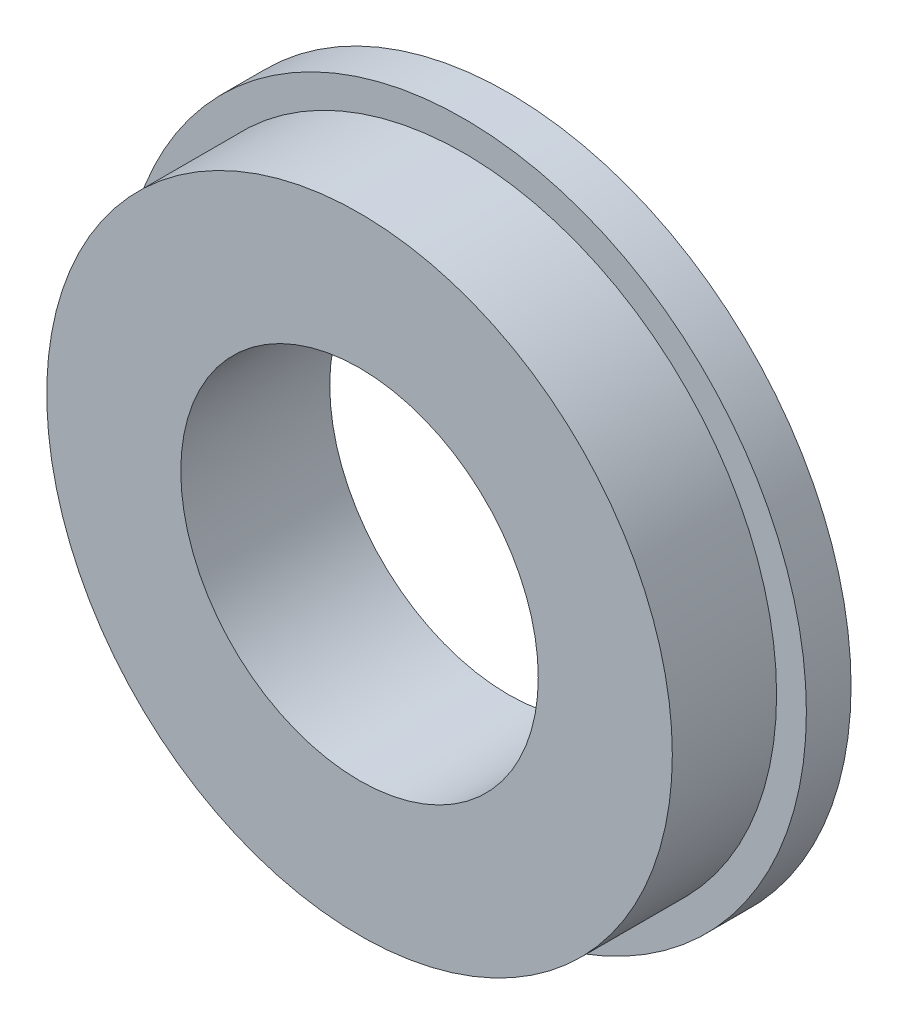
ISO-10303-21;
HEADER;
FILE_DESCRIPTION(('STEP AP214'),'2;1');
FILE_NAME('part.step','',(''),(''),'','','');
FILE_SCHEMA(('AUTOMOTIVE_DESIGN { 1 0 10303 214 1 1 1 1 }'));
ENDSEC;
DATA;
#1=APPLICATION_CONTEXT('core data for automotive mechanical design processes');
#2=APPLICATION_PROTOCOL_DEFINITION('international standard','automotive_design',2000,#1);
#3=PRODUCT_CONTEXT('',#1,'mechanical');
#4=PRODUCT('Part','Part','',(#3));
#5=PRODUCT_RELATED_PRODUCT_CATEGORY('part','',(#4));
#6=PRODUCT_DEFINITION_FORMATION('','',#4);
#7=PRODUCT_DEFINITION_CONTEXT('part definition',#1,'design');
#8=PRODUCT_DEFINITION('design','',#6,#7);
#9=PRODUCT_DEFINITION_SHAPE('','',#8);
#10=(LENGTH_UNIT() NAMED_UNIT(*) SI_UNIT(.MILLI.,.METRE.));
#11=(NAMED_UNIT(*) PLANE_ANGLE_UNIT() SI_UNIT($,.RADIAN.));
#12=(NAMED_UNIT(*) SI_UNIT($,.STERADIAN.) SOLID_ANGLE_UNIT());
#13=UNCERTAINTY_MEASURE_WITH_UNIT(LENGTH_MEASURE(1.E-05),#10,'distance_accuracy_value','');
#14=(GEOMETRIC_REPRESENTATION_CONTEXT(3) GLOBAL_UNCERTAINTY_ASSIGNED_CONTEXT((#13)) GLOBAL_UNIT_ASSIGNED_CONTEXT((#10,
#11,#12)) REPRESENTATION_CONTEXT('',''));
#15=CARTESIAN_POINT('',(0.,0.,0.));
#16=DIRECTION('',(0.,0.,1.));
#17=DIRECTION('',(1.,0.,0.));
#18=AXIS2_PLACEMENT_3D('',#15,#16,#17);
#19=CARTESIAN_POINT('',(0.,0.,1.5));
#20=DIRECTION('',(0.,0.,-1.));
#21=DIRECTION('',(-1.,0.,0.));
#22=AXIS2_PLACEMENT_3D('',#19,#20,#21);
#23=CYLINDRICAL_SURFACE('',#22,11.5);
#24=CARTESIAN_POINT('',(0.,0.,1.5));
#25=DIRECTION('',(0.,0.,1.));
#26=DIRECTION('',(1.,0.,0.));
#27=AXIS2_PLACEMENT_3D('',#24,#25,#26);
#28=CIRCLE('',#27,11.5);
#29=CARTESIAN_POINT('',(11.5,0.,1.5));
#30=VERTEX_POINT('',#29);
#31=EDGE_CURVE('E45',#30,#30,#28,.T.);
#32=ORIENTED_EDGE('',*,*,#31,.F.);
#33=EDGE_LOOP('',(#32));
#34=FACE_BOUND('',#33,.T.);
#35=CARTESIAN_POINT('',(0.,0.,0.));
#36=DIRECTION('',(0.,0.,1.));
#37=DIRECTION('',(1.,0.,0.));
#38=AXIS2_PLACEMENT_3D('',#35,#36,#37);
#39=CIRCLE('',#38,11.5);
#40=CARTESIAN_POINT('',(11.5,0.,0.));
#41=VERTEX_POINT('',#40);
#42=EDGE_CURVE('E40',#41,#41,#39,.T.);
#43=ORIENTED_EDGE('',*,*,#42,.T.);
#44=EDGE_LOOP('',(#43));
#45=FACE_BOUND('',#44,.T.);
#46=ADVANCED_FACE('F37',(#34,#45),#23,.T.);
#47=CARTESIAN_POINT('',(0.,0.,1.5));
#48=DIRECTION('',(0.,0.,1.));
#49=DIRECTION('',(1.,0.,0.));
#50=AXIS2_PLACEMENT_3D('',#47,#48,#49);
#51=PLANE('',#50);
#52=CARTESIAN_POINT('',(0.,0.,1.5));
#53=DIRECTION('',(0.,0.,1.));
#54=DIRECTION('',(1.,0.,0.));
#55=AXIS2_PLACEMENT_3D('',#52,#53,#54);
#56=CIRCLE('',#55,10.5);
#57=CARTESIAN_POINT('',(10.5,0.,1.5));
#58=VERTEX_POINT('',#57);
#59=EDGE_CURVE('E10',#58,#58,#56,.T.);
#60=ORIENTED_EDGE('',*,*,#59,.F.);
#61=EDGE_LOOP('',(#60));
#62=FACE_BOUND('',#61,.T.);
#63=ORIENTED_EDGE('',*,*,#31,.T.);
#64=EDGE_LOOP('',(#63));
#65=FACE_BOUND('',#64,.T.);
#66=ADVANCED_FACE('F86',(#62,#65),#51,.T.);
#67=CARTESIAN_POINT('',(0.,0.,0.));
#68=DIRECTION('',(0.,0.,1.));
#69=DIRECTION('',(1.,0.,0.));
#70=AXIS2_PLACEMENT_3D('',#67,#68,#69);
#71=PLANE('',#70);
#72=CARTESIAN_POINT('',(0.,0.,0.));
#73=DIRECTION('',(0.,0.,1.));
#74=DIRECTION('',(1.,0.,0.));
#75=AXIS2_PLACEMENT_3D('',#72,#73,#74);
#76=CIRCLE('',#75,6.);
#77=CARTESIAN_POINT('',(6.,0.,0.));
#78=VERTEX_POINT('',#77);
#79=EDGE_CURVE('E56',#78,#78,#76,.T.);
#80=ORIENTED_EDGE('',*,*,#79,.T.);
#81=EDGE_LOOP('',(#80));
#82=FACE_BOUND('',#81,.T.);
#83=ORIENTED_EDGE('',*,*,#42,.F.);
#84=EDGE_LOOP('',(#83));
#85=FACE_BOUND('',#84,.T.);
#86=ADVANCED_FACE('F65',(#82,#85),#71,.F.);
#87=CARTESIAN_POINT('',(0.,0.,5.));
#88=DIRECTION('',(0.,0.,-1.));
#89=DIRECTION('',(-1.,0.,0.));
#90=AXIS2_PLACEMENT_3D('',#87,#88,#89);
#91=CYLINDRICAL_SURFACE('',#90,10.5);
#92=CARTESIAN_POINT('',(0.,0.,5.));
#93=DIRECTION('',(0.,0.,1.));
#94=DIRECTION('',(1.,0.,0.));
#95=AXIS2_PLACEMENT_3D('',#92,#93,#94);
#96=CIRCLE('',#95,10.5);
#97=CARTESIAN_POINT('',(10.5,0.,5.));
#98=VERTEX_POINT('',#97);
#99=EDGE_CURVE('E52',#98,#98,#96,.T.);
#100=ORIENTED_EDGE('',*,*,#99,.F.);
#101=EDGE_LOOP('',(#100));
#102=FACE_BOUND('',#101,.T.);
#103=ORIENTED_EDGE('',*,*,#59,.T.);
#104=EDGE_LOOP('',(#103));
#105=FACE_BOUND('',#104,.T.);
#106=ADVANCED_FACE('F77',(#102,#105),#91,.T.);
#107=CARTESIAN_POINT('',(0.,0.,5.));
#108=DIRECTION('',(0.,0.,1.));
#109=DIRECTION('',(1.,0.,0.));
#110=AXIS2_PLACEMENT_3D('',#107,#108,#109);
#111=PLANE('',#110);
#112=CARTESIAN_POINT('',(0.,0.,5.));
#113=DIRECTION('',(0.,0.,1.));
#114=DIRECTION('',(1.,0.,0.));
#115=AXIS2_PLACEMENT_3D('',#112,#113,#114);
#116=CIRCLE('',#115,6.);
#117=CARTESIAN_POINT('',(6.,0.,5.));
#118=VERTEX_POINT('',#117);
#119=EDGE_CURVE('E57',#118,#118,#116,.T.);
#120=ORIENTED_EDGE('',*,*,#119,.F.);
#121=EDGE_LOOP('',(#120));
#122=FACE_BOUND('',#121,.T.);
#123=ORIENTED_EDGE('',*,*,#99,.T.);
#124=EDGE_LOOP('',(#123));
#125=FACE_BOUND('',#124,.T.);
#126=ADVANCED_FACE('F71',(#122,#125),#111,.T.);
#127=CARTESIAN_POINT('',(0.,0.,0.));
#128=DIRECTION('',(0.,0.,1.));
#129=DIRECTION('',(1.,0.,0.));
#130=AXIS2_PLACEMENT_3D('',#127,#128,#129);
#131=CYLINDRICAL_SURFACE('',#130,6.);
#132=ORIENTED_EDGE('',*,*,#79,.F.);
#133=EDGE_LOOP('',(#132));
#134=FACE_BOUND('',#133,.T.);
#135=ORIENTED_EDGE('',*,*,#119,.T.);
#136=EDGE_LOOP('',(#135));
#137=FACE_BOUND('',#136,.T.);
#138=ADVANCED_FACE('F68',(#134,#137),#131,.F.);
#139=CLOSED_SHELL('',(#46,#66,#86,#106,#126,#138));
#140=MANIFOLD_SOLID_BREP('B2',#139);
#141=ADVANCED_BREP_SHAPE_REPRESENTATION('',(#18,#140),#14);
#142=SHAPE_DEFINITION_REPRESENTATION(#9,#141);
ENDSEC;
END-ISO-10303-21;
